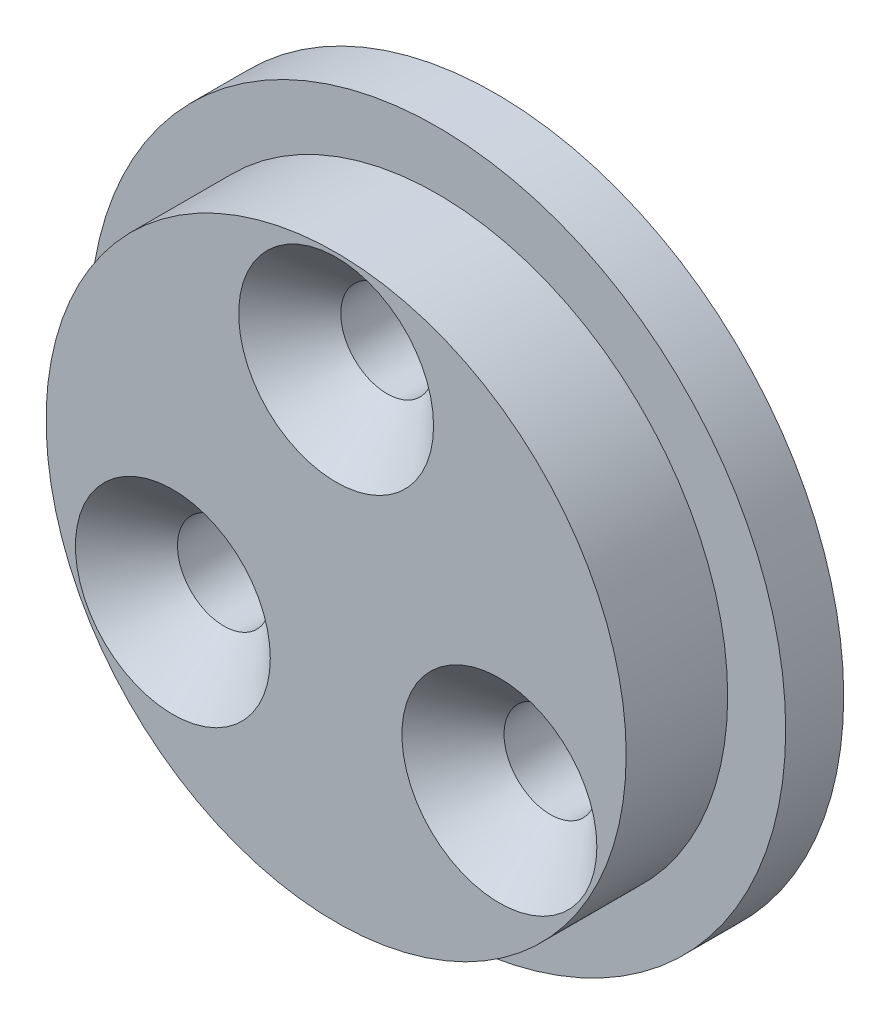
ISO-10303-21;
HEADER;
FILE_DESCRIPTION(('STEP AP214'),'2;1');
FILE_NAME('part.step','',(''),(''),'','','');
FILE_SCHEMA(('AUTOMOTIVE_DESIGN { 1 0 10303 214 1 1 1 1 }'));
ENDSEC;
DATA;
#1=APPLICATION_CONTEXT('core data for automotive mechanical design processes');
#2=APPLICATION_PROTOCOL_DEFINITION('international standard','automotive_design',2000,#1);
#3=PRODUCT_CONTEXT('',#1,'mechanical');
#4=PRODUCT('Part','Part','',(#3));
#5=PRODUCT_RELATED_PRODUCT_CATEGORY('part','',(#4));
#6=PRODUCT_DEFINITION_FORMATION('','',#4);
#7=PRODUCT_DEFINITION_CONTEXT('part definition',#1,'design');
#8=PRODUCT_DEFINITION('design','',#6,#7);
#9=PRODUCT_DEFINITION_SHAPE('','',#8);
#10=(LENGTH_UNIT() NAMED_UNIT(*) SI_UNIT(.MILLI.,.METRE.));
#11=(NAMED_UNIT(*) PLANE_ANGLE_UNIT() SI_UNIT($,.RADIAN.));
#12=(NAMED_UNIT(*) SI_UNIT($,.STERADIAN.) SOLID_ANGLE_UNIT());
#13=UNCERTAINTY_MEASURE_WITH_UNIT(LENGTH_MEASURE(1.E-05),#10,'distance_accuracy_value','');
#14=(GEOMETRIC_REPRESENTATION_CONTEXT(3) GLOBAL_UNCERTAINTY_ASSIGNED_CONTEXT((#13)) GLOBAL_UNIT_ASSIGNED_CONTEXT((#10,
#11,#12)) REPRESENTATION_CONTEXT('',''));
#15=CARTESIAN_POINT('',(0.,0.,0.));
#16=DIRECTION('',(0.,0.,1.));
#17=DIRECTION('',(1.,0.,0.));
#18=AXIS2_PLACEMENT_3D('',#15,#16,#17);
#19=CARTESIAN_POINT('',(0.,0.,0.));
#20=DIRECTION('',(0.,0.,-1.));
#21=DIRECTION('',(-1.,0.,0.));
#22=AXIS2_PLACEMENT_3D('',#19,#20,#21);
#23=PLANE('',#22);
#24=CARTESIAN_POINT('',(0.,0.,0.));
#25=DIRECTION('',(0.,0.,1.));
#26=DIRECTION('',(1.,0.,0.));
#27=AXIS2_PLACEMENT_3D('',#24,#25,#26);
#28=CIRCLE('',#27,3.);
#29=CARTESIAN_POINT('',(3.,0.,0.));
#30=VERTEX_POINT('',#29);
#31=EDGE_CURVE('E54',#30,#30,#28,.T.);
#32=ORIENTED_EDGE('',*,*,#31,.F.);
#33=EDGE_LOOP('',(#32));
#34=FACE_BOUND('',#33,.T.);
#35=ADVANCED_FACE('F43',(#34),#23,.T.);
#36=CARTESIAN_POINT('',(0.,0.,0.));
#37=DIRECTION('',(0.,0.,1.));
#38=DIRECTION('',(1.,0.,0.));
#39=AXIS2_PLACEMENT_3D('',#36,#37,#38);
#40=CYLINDRICAL_SURFACE('',#39,3.);
#41=ORIENTED_EDGE('',*,*,#31,.T.);
#42=EDGE_LOOP('',(#41));
#43=FACE_BOUND('',#42,.T.);
#44=CARTESIAN_POINT('',(0.,0.,-3.));
#45=DIRECTION('',(0.,0.,1.));
#46=DIRECTION('',(1.,0.,0.));
#47=AXIS2_PLACEMENT_3D('',#44,#45,#46);
#48=CIRCLE('',#47,3.);
#49=CARTESIAN_POINT('',(3.,0.,-3.));
#50=VERTEX_POINT('',#49);
#51=EDGE_CURVE('E56',#50,#50,#48,.T.);
#52=ORIENTED_EDGE('',*,*,#51,.F.);
#53=EDGE_LOOP('',(#52));
#54=FACE_BOUND('',#53,.T.);
#55=ADVANCED_FACE('F132',(#43,#54),#40,.F.);
#56=CARTESIAN_POINT('',(9.5,0.,-3.));
#57=DIRECTION('',(0.,0.,-1.));
#58=DIRECTION('',(-1.,0.,0.));
#59=AXIS2_PLACEMENT_3D('',#56,#57,#58);
#60=PLANE('',#59);
#61=CARTESIAN_POINT('',(0.,6.5,-3.));
#62=DIRECTION('',(0.,0.,-1.));
#63=DIRECTION('',(-1.,0.,0.));
#64=AXIS2_PLACEMENT_3D('',#61,#62,#63);
#65=CIRCLE('',#64,1.6);
#66=CARTESIAN_POINT('',(-1.6,6.5,-3.));
#67=VERTEX_POINT('',#66);
#68=EDGE_CURVE('E65',#67,#67,#65,.T.);
#69=ORIENTED_EDGE('',*,*,#68,.F.);
#70=EDGE_LOOP('',(#69));
#71=FACE_BOUND('',#70,.T.);
#72=CARTESIAN_POINT('',(5.62916512459885,-3.25,-3.));
#73=DIRECTION('',(0.,0.,-1.));
#74=DIRECTION('',(-1.,0.,0.));
#75=AXIS2_PLACEMENT_3D('',#72,#73,#74);
#76=CIRCLE('',#75,1.6);
#77=CARTESIAN_POINT('',(4.02916512459885,-3.25,-3.));
#78=VERTEX_POINT('',#77);
#79=EDGE_CURVE('E70',#78,#78,#76,.T.);
#80=ORIENTED_EDGE('',*,*,#79,.F.);
#81=EDGE_LOOP('',(#80));
#82=FACE_BOUND('',#81,.T.);
#83=CARTESIAN_POINT('',(-5.62916512459885,-3.25,-3.));
#84=DIRECTION('',(0.,0.,-1.));
#85=DIRECTION('',(-1.,0.,0.));
#86=AXIS2_PLACEMENT_3D('',#83,#84,#85);
#87=CIRCLE('',#86,1.6);
#88=CARTESIAN_POINT('',(-7.22916512459885,-3.25,-3.));
#89=VERTEX_POINT('',#88);
#90=EDGE_CURVE('E75',#89,#89,#87,.T.);
#91=ORIENTED_EDGE('',*,*,#90,.F.);
#92=EDGE_LOOP('',(#91));
#93=FACE_BOUND('',#92,.T.);
#94=ORIENTED_EDGE('',*,*,#51,.T.);
#95=EDGE_LOOP('',(#94));
#96=FACE_BOUND('',#95,.T.);
#97=CARTESIAN_POINT('',(0.,0.,-3.));
#98=DIRECTION('',(0.,0.,1.));
#99=DIRECTION('',(1.,0.,0.));
#100=AXIS2_PLACEMENT_3D('',#97,#98,#99);
#101=CIRCLE('',#100,9.5);
#102=CARTESIAN_POINT('',(9.5,0.,-3.));
#103=VERTEX_POINT('',#102);
#104=EDGE_CURVE('E78',#103,#103,#101,.T.);
#105=ORIENTED_EDGE('',*,*,#104,.F.);
#106=EDGE_LOOP('',(#105));
#107=FACE_BOUND('',#106,.T.);
#108=ADVANCED_FACE('F138',(#71,#82,#93,#96,#107),#60,.T.);
#109=CARTESIAN_POINT('',(0.,0.,0.));
#110=DIRECTION('',(0.,0.,1.));
#111=DIRECTION('',(1.,0.,0.));
#112=AXIS2_PLACEMENT_3D('',#109,#110,#111);
#113=CYLINDRICAL_SURFACE('',#112,9.5);
#114=CARTESIAN_POINT('',(0.,0.,-4.19999999999999));
#115=DIRECTION('',(0.,0.,-1.));
#116=DIRECTION('',(-1.,0.,0.));
#117=AXIS2_PLACEMENT_3D('',#114,#115,#116);
#118=CIRCLE('',#117,9.5);
#119=CARTESIAN_POINT('',(-9.5,0.,-4.19999999999999));
#120=VERTEX_POINT('',#119);
#121=EDGE_CURVE('E10',#120,#120,#118,.T.);
#122=ORIENTED_EDGE('',*,*,#121,.T.);
#123=EDGE_LOOP('',(#122));
#124=FACE_BOUND('',#123,.T.);
#125=ORIENTED_EDGE('',*,*,#104,.T.);
#126=EDGE_LOOP('',(#125));
#127=FACE_BOUND('',#126,.T.);
#128=ADVANCED_FACE('F145',(#124,#127),#113,.F.);
#129=CARTESIAN_POINT('',(9.5,0.,-5.));
#130=DIRECTION('',(0.,0.,-1.));
#131=DIRECTION('',(-1.,0.,0.));
#132=AXIS2_PLACEMENT_3D('',#129,#130,#131);
#133=PLANE('',#132);
#134=CARTESIAN_POINT('',(0.,0.,-5.));
#135=DIRECTION('',(0.,0.,-1.));
#136=DIRECTION('',(-1.,0.,0.));
#137=AXIS2_PLACEMENT_3D('',#134,#135,#136);
#138=CIRCLE('',#137,10.3);
#139=CARTESIAN_POINT('',(-10.3,0.,-5.));
#140=VERTEX_POINT('',#139);
#141=EDGE_CURVE('E51',#140,#140,#138,.F.);
#142=ORIENTED_EDGE('',*,*,#141,.T.);
#143=EDGE_LOOP('',(#142));
#144=FACE_BOUND('',#143,.T.);
#145=CARTESIAN_POINT('',(0.,0.,-5.));
#146=DIRECTION('',(0.,0.,1.));
#147=DIRECTION('',(1.,0.,0.));
#148=AXIS2_PLACEMENT_3D('',#145,#146,#147);
#149=CIRCLE('',#148,12.);
#150=CARTESIAN_POINT('',(12.,0.,-5.));
#151=VERTEX_POINT('',#150);
#152=EDGE_CURVE('E85',#151,#151,#149,.T.);
#153=ORIENTED_EDGE('',*,*,#152,.F.);
#154=EDGE_LOOP('',(#153));
#155=FACE_BOUND('',#154,.T.);
#156=ADVANCED_FACE('F146',(#144,#155),#133,.T.);
#157=CARTESIAN_POINT('',(0.,0.,0.));
#158=DIRECTION('',(0.,0.,1.));
#159=DIRECTION('',(1.,0.,0.));
#160=AXIS2_PLACEMENT_3D('',#157,#158,#159);
#161=CYLINDRICAL_SURFACE('',#160,12.);
#162=ORIENTED_EDGE('',*,*,#152,.T.);
#163=EDGE_LOOP('',(#162));
#164=FACE_BOUND('',#163,.T.);
#165=CARTESIAN_POINT('',(0.,0.,-3.));
#166=DIRECTION('',(0.,0.,1.));
#167=DIRECTION('',(1.,0.,0.));
#168=AXIS2_PLACEMENT_3D('',#165,#166,#167);
#169=CIRCLE('',#168,12.);
#170=CARTESIAN_POINT('',(12.,0.,-3.));
#171=VERTEX_POINT('',#170);
#172=EDGE_CURVE('E81',#171,#171,#169,.T.);
#173=ORIENTED_EDGE('',*,*,#172,.F.);
#174=EDGE_LOOP('',(#173));
#175=FACE_BOUND('',#174,.T.);
#176=ADVANCED_FACE('F129',(#164,#175),#161,.T.);
#177=CARTESIAN_POINT('',(10.,0.,-3.));
#178=DIRECTION('',(0.,0.,1.));
#179=DIRECTION('',(1.,0.,0.));
#180=AXIS2_PLACEMENT_3D('',#177,#178,#179);
#181=PLANE('',#180);
#182=ORIENTED_EDGE('',*,*,#172,.T.);
#183=EDGE_LOOP('',(#182));
#184=FACE_BOUND('',#183,.T.);
#185=CARTESIAN_POINT('',(0.,0.,-3.));
#186=DIRECTION('',(0.,0.,1.));
#187=DIRECTION('',(1.,0.,0.));
#188=AXIS2_PLACEMENT_3D('',#185,#186,#187);
#189=CIRCLE('',#188,10.);
#190=CARTESIAN_POINT('',(10.,0.,-3.));
#191=VERTEX_POINT('',#190);
#192=EDGE_CURVE('E86',#191,#191,#189,.T.);
#193=ORIENTED_EDGE('',*,*,#192,.F.);
#194=EDGE_LOOP('',(#193));
#195=FACE_BOUND('',#194,.T.);
#196=ADVANCED_FACE('F125',(#184,#195),#181,.T.);
#197=CARTESIAN_POINT('',(0.,0.,0.));
#198=DIRECTION('',(0.,0.,1.));
#199=DIRECTION('',(1.,0.,0.));
#200=AXIS2_PLACEMENT_3D('',#197,#198,#199);
#201=CYLINDRICAL_SURFACE('',#200,10.);
#202=ORIENTED_EDGE('',*,*,#192,.T.);
#203=EDGE_LOOP('',(#202));
#204=FACE_BOUND('',#203,.T.);
#205=CARTESIAN_POINT('',(0.,0.,0.499999999999999));
#206=DIRECTION('',(0.,0.,1.));
#207=DIRECTION('',(1.,0.,0.));
#208=AXIS2_PLACEMENT_3D('',#205,#206,#207);
#209=CIRCLE('',#208,10.);
#210=CARTESIAN_POINT('',(10.,0.,0.499999999999999));
#211=VERTEX_POINT('',#210);
#212=EDGE_CURVE('E74',#211,#211,#209,.T.);
#213=ORIENTED_EDGE('',*,*,#212,.F.);
#214=EDGE_LOOP('',(#213));
#215=FACE_BOUND('',#214,.T.);
#216=ADVANCED_FACE('F114',(#204,#215),#201,.T.);
#217=CARTESIAN_POINT('',(10.,0.,0.499999999999999));
#218=DIRECTION('',(0.,0.,1.));
#219=DIRECTION('',(1.,0.,0.));
#220=AXIS2_PLACEMENT_3D('',#217,#218,#219);
#221=PLANE('',#220);
#222=CARTESIAN_POINT('',(0.,6.5,0.499999999999999));
#223=DIRECTION('',(0.,0.,1.));
#224=DIRECTION('',(1.,0.,0.));
#225=AXIS2_PLACEMENT_3D('',#222,#223,#224);
#226=CIRCLE('',#225,3.36);
#227=CARTESIAN_POINT('',(3.36,6.5,0.499999999999999));
#228=VERTEX_POINT('',#227);
#229=EDGE_CURVE('E103',#228,#228,#226,.T.);
#230=ORIENTED_EDGE('',*,*,#229,.F.);
#231=EDGE_LOOP('',(#230));
#232=FACE_BOUND('',#231,.T.);
#233=CARTESIAN_POINT('',(5.62916512459885,-3.25,0.499999999999999));
#234=DIRECTION('',(0.,0.,1.));
#235=DIRECTION('',(1.,0.,0.));
#236=AXIS2_PLACEMENT_3D('',#233,#234,#235);
#237=CIRCLE('',#236,3.36);
#238=CARTESIAN_POINT('',(8.98916512459885,-3.25,0.499999999999999));
#239=VERTEX_POINT('',#238);
#240=EDGE_CURVE('E64',#239,#239,#237,.T.);
#241=ORIENTED_EDGE('',*,*,#240,.F.);
#242=EDGE_LOOP('',(#241));
#243=FACE_BOUND('',#242,.T.);
#244=CARTESIAN_POINT('',(-5.62916512459885,-3.25,0.499999999999999));
#245=DIRECTION('',(0.,0.,1.));
#246=DIRECTION('',(1.,0.,0.));
#247=AXIS2_PLACEMENT_3D('',#244,#245,#246);
#248=CIRCLE('',#247,3.36);
#249=CARTESIAN_POINT('',(-2.26916512459885,-3.25,0.499999999999999));
#250=VERTEX_POINT('',#249);
#251=EDGE_CURVE('E66',#250,#250,#248,.T.);
#252=ORIENTED_EDGE('',*,*,#251,.F.);
#253=EDGE_LOOP('',(#252));
#254=FACE_BOUND('',#253,.T.);
#255=ORIENTED_EDGE('',*,*,#212,.T.);
#256=EDGE_LOOP('',(#255));
#257=FACE_BOUND('',#256,.T.);
#258=ADVANCED_FACE('F108',(#232,#243,#254,#257),#221,.T.);
#259=CARTESIAN_POINT('',(-5.62916512459885,-3.25,0.499999999999999));
#260=DIRECTION('',(0.,0.,1.));
#261=DIRECTION('',(1.,0.,0.));
#262=AXIS2_PLACEMENT_3D('',#259,#260,#261);
#263=CYLINDRICAL_SURFACE('',#262,1.6);
#264=ORIENTED_EDGE('',*,*,#90,.T.);
#265=EDGE_LOOP('',(#264));
#266=FACE_BOUND('',#265,.T.);
#267=CARTESIAN_POINT('',(-5.62916512459885,-3.25,-1.26));
#268=DIRECTION('',(0.,0.,1.));
#269=DIRECTION('',(1.,0.,0.));
#270=AXIS2_PLACEMENT_3D('',#267,#268,#269);
#271=CIRCLE('',#270,1.6);
#272=CARTESIAN_POINT('',(-4.02916512459885,-3.25,-1.26));
#273=VERTEX_POINT('',#272);
#274=EDGE_CURVE('E73',#273,#273,#271,.T.);
#275=ORIENTED_EDGE('',*,*,#274,.T.);
#276=EDGE_LOOP('',(#275));
#277=FACE_BOUND('',#276,.T.);
#278=ADVANCED_FACE('F115',(#266,#277),#263,.F.);
#279=CARTESIAN_POINT('',(-5.62916512459885,-3.25,0.499999999999999));
#280=DIRECTION('',(0.,0.,1.));
#281=DIRECTION('',(1.,0.,0.));
#282=AXIS2_PLACEMENT_3D('',#279,#280,#281);
#283=CONICAL_SURFACE('',#282,3.36,0.785398163397448);
#284=ORIENTED_EDGE('',*,*,#274,.F.);
#285=EDGE_LOOP('',(#284));
#286=FACE_BOUND('',#285,.T.);
#287=ORIENTED_EDGE('',*,*,#251,.T.);
#288=EDGE_LOOP('',(#287));
#289=FACE_BOUND('',#288,.T.);
#290=ADVANCED_FACE('F188',(#286,#289),#283,.F.);
#291=CARTESIAN_POINT('',(5.62916512459885,-3.25,0.499999999999999));
#292=DIRECTION('',(0.,0.,1.));
#293=DIRECTION('',(1.,0.,0.));
#294=AXIS2_PLACEMENT_3D('',#291,#292,#293);
#295=CYLINDRICAL_SURFACE('',#294,1.6);
#296=ORIENTED_EDGE('',*,*,#79,.T.);
#297=EDGE_LOOP('',(#296));
#298=FACE_BOUND('',#297,.T.);
#299=CARTESIAN_POINT('',(5.62916512459885,-3.25,-1.26));
#300=DIRECTION('',(0.,0.,1.));
#301=DIRECTION('',(1.,0.,0.));
#302=AXIS2_PLACEMENT_3D('',#299,#300,#301);
#303=CIRCLE('',#302,1.6);
#304=CARTESIAN_POINT('',(7.22916512459885,-3.25,-1.26));
#305=VERTEX_POINT('',#304);
#306=EDGE_CURVE('E72',#305,#305,#303,.T.);
#307=ORIENTED_EDGE('',*,*,#306,.T.);
#308=EDGE_LOOP('',(#307));
#309=FACE_BOUND('',#308,.T.);
#310=ADVANCED_FACE('F200',(#298,#309),#295,.F.);
#311=CARTESIAN_POINT('',(5.62916512459885,-3.25,0.499999999999999));
#312=DIRECTION('',(0.,0.,1.));
#313=DIRECTION('',(1.,0.,0.));
#314=AXIS2_PLACEMENT_3D('',#311,#312,#313);
#315=CONICAL_SURFACE('',#314,3.36,0.785398163397449);
#316=ORIENTED_EDGE('',*,*,#306,.F.);
#317=EDGE_LOOP('',(#316));
#318=FACE_BOUND('',#317,.T.);
#319=ORIENTED_EDGE('',*,*,#240,.T.);
#320=EDGE_LOOP('',(#319));
#321=FACE_BOUND('',#320,.T.);
#322=ADVANCED_FACE('F207',(#318,#321),#315,.F.);
#323=CARTESIAN_POINT('',(0.,6.5,0.499999999999999));
#324=DIRECTION('',(0.,0.,1.));
#325=DIRECTION('',(1.,0.,0.));
#326=AXIS2_PLACEMENT_3D('',#323,#324,#325);
#327=CYLINDRICAL_SURFACE('',#326,1.6);
#328=ORIENTED_EDGE('',*,*,#68,.T.);
#329=EDGE_LOOP('',(#328));
#330=FACE_BOUND('',#329,.T.);
#331=CARTESIAN_POINT('',(0.,6.5,-1.26));
#332=DIRECTION('',(0.,0.,1.));
#333=DIRECTION('',(1.,0.,0.));
#334=AXIS2_PLACEMENT_3D('',#331,#332,#333);
#335=CIRCLE('',#334,1.6);
#336=CARTESIAN_POINT('',(1.6,6.5,-1.26));
#337=VERTEX_POINT('',#336);
#338=EDGE_CURVE('E67',#337,#337,#335,.T.);
#339=ORIENTED_EDGE('',*,*,#338,.T.);
#340=EDGE_LOOP('',(#339));
#341=FACE_BOUND('',#340,.T.);
#342=ADVANCED_FACE('F218',(#330,#341),#327,.F.);
#343=CARTESIAN_POINT('',(0.,6.5,0.499999999999999));
#344=DIRECTION('',(0.,0.,1.));
#345=DIRECTION('',(1.,0.,0.));
#346=AXIS2_PLACEMENT_3D('',#343,#344,#345);
#347=CONICAL_SURFACE('',#346,3.36,0.785398163397449);
#348=ORIENTED_EDGE('',*,*,#338,.F.);
#349=EDGE_LOOP('',(#348));
#350=FACE_BOUND('',#349,.T.);
#351=ORIENTED_EDGE('',*,*,#229,.T.);
#352=EDGE_LOOP('',(#351));
#353=FACE_BOUND('',#352,.T.);
#354=ADVANCED_FACE('F110',(#350,#353),#347,.F.);
#355=CARTESIAN_POINT('',(0.,0.,-5.));
#356=DIRECTION('',(0.,0.,-1.));
#357=DIRECTION('',(-1.,0.,0.));
#358=AXIS2_PLACEMENT_3D('',#355,#356,#357);
#359=CONICAL_SURFACE('',#358,10.3,0.785398163397447);
#360=ORIENTED_EDGE('',*,*,#121,.F.);
#361=EDGE_LOOP('',(#360));
#362=FACE_BOUND('',#361,.T.);
#363=ORIENTED_EDGE('',*,*,#141,.F.);
#364=EDGE_LOOP('',(#363));
#365=FACE_BOUND('',#364,.T.);
#366=ADVANCED_FACE('F46',(#362,#365),#359,.F.);
#367=CLOSED_SHELL('',(#35,#55,#108,#128,#156,#176,#196,#216,#258,#278,#290,#310,#322,#342,#354,#366));
#368=MANIFOLD_SOLID_BREP('B2',#367);
#369=ADVANCED_BREP_SHAPE_REPRESENTATION('',(#18,#368),#14);
#370=SHAPE_DEFINITION_REPRESENTATION(#9,#369);
ENDSEC;
END-ISO-10303-21;
